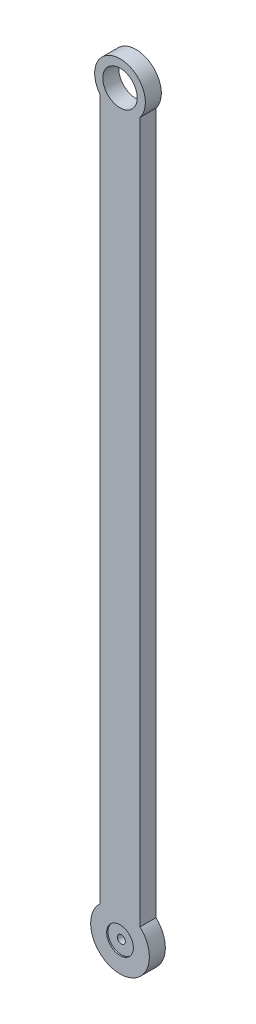
ISO-10303-21;
HEADER;
FILE_DESCRIPTION(('STEP AP214'),'2;1');
FILE_NAME('part.step','',(''),(''),'','','');
FILE_SCHEMA(('AUTOMOTIVE_DESIGN { 1 0 10303 214 1 1 1 1 }'));
ENDSEC;
DATA;
#1=APPLICATION_CONTEXT('core data for automotive mechanical design processes');
#2=APPLICATION_PROTOCOL_DEFINITION('international standard','automotive_design',2000,#1);
#3=PRODUCT_CONTEXT('',#1,'mechanical');
#4=PRODUCT('Part','Part','',(#3));
#5=PRODUCT_RELATED_PRODUCT_CATEGORY('part','',(#4));
#6=PRODUCT_DEFINITION_FORMATION('','',#4);
#7=PRODUCT_DEFINITION_CONTEXT('part definition',#1,'design');
#8=PRODUCT_DEFINITION('design','',#6,#7);
#9=PRODUCT_DEFINITION_SHAPE('','',#8);
#10=(LENGTH_UNIT() NAMED_UNIT(*) SI_UNIT(.MILLI.,.METRE.));
#11=(NAMED_UNIT(*) PLANE_ANGLE_UNIT() SI_UNIT($,.RADIAN.));
#12=(NAMED_UNIT(*) SI_UNIT($,.STERADIAN.) SOLID_ANGLE_UNIT());
#13=UNCERTAINTY_MEASURE_WITH_UNIT(LENGTH_MEASURE(1.E-05),#10,'distance_accuracy_value','');
#14=(GEOMETRIC_REPRESENTATION_CONTEXT(3) GLOBAL_UNCERTAINTY_ASSIGNED_CONTEXT((#13)) GLOBAL_UNIT_ASSIGNED_CONTEXT((#10,
#11,#12)) REPRESENTATION_CONTEXT('',''));
#15=CARTESIAN_POINT('',(0.,0.,0.));
#16=DIRECTION('',(0.,0.,1.));
#17=DIRECTION('',(1.,0.,0.));
#18=AXIS2_PLACEMENT_3D('',#15,#16,#17);
#19=CARTESIAN_POINT('',(7.5,7.5,10.));
#20=DIRECTION('',(0.,0.,-1.));
#21=DIRECTION('',(-1.,0.,0.));
#22=AXIS2_PLACEMENT_3D('',#19,#20,#21);
#23=CYLINDRICAL_SURFACE('',#22,1.5);
#24=CARTESIAN_POINT('',(7.5,7.5,0.));
#25=DIRECTION('',(0.,0.,-1.));
#26=DIRECTION('',(-1.,0.,0.));
#27=AXIS2_PLACEMENT_3D('',#24,#25,#26);
#28=CIRCLE('',#27,1.5);
#29=CARTESIAN_POINT('',(6.,7.5,0.));
#30=VERTEX_POINT('',#29);
#31=EDGE_CURVE('E105',#30,#30,#28,.T.);
#32=ORIENTED_EDGE('',*,*,#31,.T.);
#33=EDGE_LOOP('',(#32));
#34=FACE_BOUND('',#33,.T.);
#35=CARTESIAN_POINT('',(7.5,7.5,5.5));
#36=DIRECTION('',(0.,0.,1.));
#37=DIRECTION('',(1.,0.,0.));
#38=AXIS2_PLACEMENT_3D('',#35,#36,#37);
#39=CIRCLE('',#38,1.5);
#40=CARTESIAN_POINT('',(9.,7.5,5.5));
#41=VERTEX_POINT('',#40);
#42=EDGE_CURVE('E37',#41,#41,#39,.F.);
#43=ORIENTED_EDGE('',*,*,#42,.F.);
#44=EDGE_LOOP('',(#43));
#45=FACE_BOUND('',#44,.T.);
#46=ADVANCED_FACE('F33',(#34,#45),#23,.F.);
#47=CARTESIAN_POINT('',(0.,0.,6.));
#48=DIRECTION('',(1.,0.,0.));
#49=DIRECTION('',(0.,0.,-1.));
#50=AXIS2_PLACEMENT_3D('',#47,#48,#49);
#51=PLANE('',#50);
#52=DIRECTION('',(0.,-1.,0.));
#53=VECTOR('',#52,1.);
#54=CARTESIAN_POINT('',(0.,0.,6.));
#55=LINE('',#54,#53);
#56=CARTESIAN_POINT('',(0.,278.419048105155,6.));
#57=VERTEX_POINT('',#56);
#58=CARTESIAN_POINT('',(0.,15.5467384697156,6.));
#59=VERTEX_POINT('',#58);
#60=EDGE_CURVE('E42',#57,#59,#55,.T.);
#61=ORIENTED_EDGE('',*,*,#60,.F.);
#62=DIRECTION('',(0.,0.,1.));
#63=VECTOR('',#62,1.);
#64=CARTESIAN_POINT('',(0.,278.419048105155,0.));
#65=LINE('',#64,#63);
#66=CARTESIAN_POINT('',(0.,278.419048105155,0.));
#67=VERTEX_POINT('',#66);
#68=EDGE_CURVE('E76',#57,#67,#65,.F.);
#69=ORIENTED_EDGE('',*,*,#68,.T.);
#70=DIRECTION('',(0.,-1.,0.));
#71=VECTOR('',#70,1.);
#72=CARTESIAN_POINT('',(0.,0.,0.));
#73=LINE('',#72,#71);
#74=CARTESIAN_POINT('',(0.,15.5467384697156,0.));
#75=VERTEX_POINT('',#74);
#76=EDGE_CURVE('E87',#67,#75,#73,.T.);
#77=ORIENTED_EDGE('',*,*,#76,.T.);
#78=DIRECTION('',(0.,0.,1.));
#79=VECTOR('',#78,1.);
#80=CARTESIAN_POINT('',(0.,15.5467384697156,0.));
#81=LINE('',#80,#79);
#82=EDGE_CURVE('E94',#75,#59,#81,.T.);
#83=ORIENTED_EDGE('',*,*,#82,.T.);
#84=EDGE_LOOP('',(#61,#69,#77,#83));
#85=FACE_BOUND('',#84,.T.);
#86=ADVANCED_FACE('F35',(#85),#51,.F.);
#87=CARTESIAN_POINT('',(15.,0.,6.));
#88=DIRECTION('',(-1.,0.,0.));
#89=DIRECTION('',(0.,0.,1.));
#90=AXIS2_PLACEMENT_3D('',#87,#88,#89);
#91=PLANE('',#90);
#92=DIRECTION('',(0.,1.,0.));
#93=VECTOR('',#92,1.);
#94=CARTESIAN_POINT('',(15.,0.,0.));
#95=LINE('',#94,#93);
#96=CARTESIAN_POINT('',(15.,15.5467384697156,0.));
#97=VERTEX_POINT('',#96);
#98=CARTESIAN_POINT('',(15.,278.419048105155,0.));
#99=VERTEX_POINT('',#98);
#100=EDGE_CURVE('E93',#97,#99,#95,.T.);
#101=ORIENTED_EDGE('',*,*,#100,.T.);
#102=DIRECTION('',(0.,0.,1.));
#103=VECTOR('',#102,1.);
#104=CARTESIAN_POINT('',(15.,278.419048105155,0.));
#105=LINE('',#104,#103);
#106=CARTESIAN_POINT('',(15.,278.419048105155,6.));
#107=VERTEX_POINT('',#106);
#108=EDGE_CURVE('E78',#99,#107,#105,.T.);
#109=ORIENTED_EDGE('',*,*,#108,.T.);
#110=DIRECTION('',(0.,1.,0.));
#111=VECTOR('',#110,1.);
#112=CARTESIAN_POINT('',(15.,0.,6.));
#113=LINE('',#112,#111);
#114=CARTESIAN_POINT('',(15.,15.5467384697156,6.));
#115=VERTEX_POINT('',#114);
#116=EDGE_CURVE('E11',#115,#107,#113,.T.);
#117=ORIENTED_EDGE('',*,*,#116,.F.);
#118=DIRECTION('',(0.,0.,1.));
#119=VECTOR('',#118,1.);
#120=CARTESIAN_POINT('',(15.,15.5467384697156,0.));
#121=LINE('',#120,#119);
#122=EDGE_CURVE('E96',#115,#97,#121,.F.);
#123=ORIENTED_EDGE('',*,*,#122,.T.);
#124=EDGE_LOOP('',(#101,#109,#117,#123));
#125=FACE_BOUND('',#124,.T.);
#126=ADVANCED_FACE('F133',(#125),#91,.F.);
#127=CARTESIAN_POINT('',(0.,0.,6.));
#128=DIRECTION('',(0.,0.,-1.));
#129=DIRECTION('',(-1.,0.,0.));
#130=AXIS2_PLACEMENT_3D('',#127,#128,#129);
#131=PLANE('',#130);
#132=CARTESIAN_POINT('',(7.5,7.5,6.));
#133=DIRECTION('',(0.,0.,1.));
#134=DIRECTION('',(1.,0.,0.));
#135=AXIS2_PLACEMENT_3D('',#132,#133,#134);
#136=CIRCLE('',#135,5.);
#137=CARTESIAN_POINT('',(12.5,7.5,6.));
#138=VERTEX_POINT('',#137);
#139=EDGE_CURVE('E115',#138,#138,#136,.T.);
#140=ORIENTED_EDGE('',*,*,#139,.F.);
#141=EDGE_LOOP('',(#140));
#142=FACE_BOUND('',#141,.T.);
#143=CARTESIAN_POINT('',(7.5,284.25,6.));
#144=DIRECTION('',(0.,0.,-1.));
#145=DIRECTION('',(-1.,0.,0.));
#146=AXIS2_PLACEMENT_3D('',#143,#144,#145);
#147=CIRCLE('',#146,6.45);
#148=CARTESIAN_POINT('',(1.05,284.25,6.));
#149=VERTEX_POINT('',#148);
#150=EDGE_CURVE('E109',#149,#149,#147,.T.);
#151=ORIENTED_EDGE('',*,*,#150,.T.);
#152=EDGE_LOOP('',(#151));
#153=FACE_BOUND('',#152,.T.);
#154=CARTESIAN_POINT('',(7.5,284.25,6.));
#155=DIRECTION('',(0.,0.,1.));
#156=DIRECTION('',(1.,0.,0.));
#157=AXIS2_PLACEMENT_3D('',#154,#155,#156);
#158=CIRCLE('',#157,9.50000000000001);
#159=EDGE_CURVE('E83',#107,#57,#158,.T.);
#160=ORIENTED_EDGE('',*,*,#159,.T.);
#161=ORIENTED_EDGE('',*,*,#60,.T.);
#162=CARTESIAN_POINT('',(7.5,7.5,6.));
#163=DIRECTION('',(0.,0.,1.));
#164=DIRECTION('',(1.,0.,0.));
#165=AXIS2_PLACEMENT_3D('',#162,#163,#164);
#166=CIRCLE('',#165,11.);
#167=EDGE_CURVE('E49',#59,#115,#166,.T.);
#168=ORIENTED_EDGE('',*,*,#167,.T.);
#169=ORIENTED_EDGE('',*,*,#116,.T.);
#170=EDGE_LOOP('',(#160,#161,#168,#169));
#171=FACE_BOUND('',#170,.T.);
#172=ADVANCED_FACE('F144',(#142,#153,#171),#131,.F.);
#173=CARTESIAN_POINT('',(0.,0.,0.));
#174=DIRECTION('',(0.,0.,-1.));
#175=DIRECTION('',(-1.,0.,0.));
#176=AXIS2_PLACEMENT_3D('',#173,#174,#175);
#177=PLANE('',#176);
#178=CARTESIAN_POINT('',(7.5,284.25,0.));
#179=DIRECTION('',(0.,0.,-1.));
#180=DIRECTION('',(-1.,0.,0.));
#181=AXIS2_PLACEMENT_3D('',#178,#179,#180);
#182=CIRCLE('',#181,6.45);
#183=CARTESIAN_POINT('',(1.05,284.25,0.));
#184=VERTEX_POINT('',#183);
#185=EDGE_CURVE('E112',#184,#184,#182,.T.);
#186=ORIENTED_EDGE('',*,*,#185,.F.);
#187=EDGE_LOOP('',(#186));
#188=FACE_BOUND('',#187,.T.);
#189=ORIENTED_EDGE('',*,*,#31,.F.);
#190=EDGE_LOOP('',(#189));
#191=FACE_BOUND('',#190,.T.);
#192=ORIENTED_EDGE('',*,*,#76,.F.);
#193=CARTESIAN_POINT('',(7.5,284.25,0.));
#194=DIRECTION('',(0.,0.,1.));
#195=DIRECTION('',(1.,0.,0.));
#196=AXIS2_PLACEMENT_3D('',#193,#194,#195);
#197=CIRCLE('',#196,9.50000000000001);
#198=EDGE_CURVE('E73',#99,#67,#197,.T.);
#199=ORIENTED_EDGE('',*,*,#198,.F.);
#200=ORIENTED_EDGE('',*,*,#100,.F.);
#201=CARTESIAN_POINT('',(7.5,7.5,0.));
#202=DIRECTION('',(0.,0.,1.));
#203=DIRECTION('',(1.,0.,0.));
#204=AXIS2_PLACEMENT_3D('',#201,#202,#203);
#205=CIRCLE('',#204,11.);
#206=EDGE_CURVE('E92',#75,#97,#205,.T.);
#207=ORIENTED_EDGE('',*,*,#206,.F.);
#208=EDGE_LOOP('',(#192,#199,#200,#207));
#209=FACE_BOUND('',#208,.T.);
#210=ADVANCED_FACE('F91',(#188,#191,#209),#177,.T.);
#211=CARTESIAN_POINT('',(7.5,7.5,0.));
#212=DIRECTION('',(0.,0.,1.));
#213=DIRECTION('',(1.,0.,0.));
#214=AXIS2_PLACEMENT_3D('',#211,#212,#213);
#215=CYLINDRICAL_SURFACE('',#214,11.);
#216=ORIENTED_EDGE('',*,*,#82,.F.);
#217=ORIENTED_EDGE('',*,*,#206,.T.);
#218=ORIENTED_EDGE('',*,*,#122,.F.);
#219=ORIENTED_EDGE('',*,*,#167,.F.);
#220=EDGE_LOOP('',(#216,#217,#218,#219));
#221=FACE_BOUND('',#220,.T.);
#222=ADVANCED_FACE('F140',(#221),#215,.T.);
#223=CARTESIAN_POINT('',(7.5,284.25,0.));
#224=DIRECTION('',(0.,0.,1.));
#225=DIRECTION('',(1.,0.,0.));
#226=AXIS2_PLACEMENT_3D('',#223,#224,#225);
#227=CYLINDRICAL_SURFACE('',#226,9.50000000000001);
#228=ORIENTED_EDGE('',*,*,#68,.F.);
#229=ORIENTED_EDGE('',*,*,#159,.F.);
#230=ORIENTED_EDGE('',*,*,#108,.F.);
#231=ORIENTED_EDGE('',*,*,#198,.T.);
#232=EDGE_LOOP('',(#228,#229,#230,#231));
#233=FACE_BOUND('',#232,.T.);
#234=ADVANCED_FACE('F75',(#233),#227,.T.);
#235=CARTESIAN_POINT('',(7.5,284.25,10.));
#236=DIRECTION('',(0.,0.,-1.));
#237=DIRECTION('',(-1.,0.,0.));
#238=AXIS2_PLACEMENT_3D('',#235,#236,#237);
#239=CYLINDRICAL_SURFACE('',#238,6.45);
#240=ORIENTED_EDGE('',*,*,#185,.T.);
#241=EDGE_LOOP('',(#240));
#242=FACE_BOUND('',#241,.T.);
#243=ORIENTED_EDGE('',*,*,#150,.F.);
#244=EDGE_LOOP('',(#243));
#245=FACE_BOUND('',#244,.T.);
#246=ADVANCED_FACE('F136',(#242,#245),#239,.F.);
#247=CARTESIAN_POINT('',(7.5,7.5,5.5));
#248=DIRECTION('',(0.,0.,1.));
#249=DIRECTION('',(1.,0.,0.));
#250=AXIS2_PLACEMENT_3D('',#247,#248,#249);
#251=PLANE('',#250);
#252=CARTESIAN_POINT('',(7.5,7.5,5.5));
#253=DIRECTION('',(0.,0.,1.));
#254=DIRECTION('',(1.,0.,0.));
#255=AXIS2_PLACEMENT_3D('',#252,#253,#254);
#256=CIRCLE('',#255,5.);
#257=CARTESIAN_POINT('',(12.5,7.5,5.5));
#258=VERTEX_POINT('',#257);
#259=EDGE_CURVE('E118',#258,#258,#256,.T.);
#260=ORIENTED_EDGE('',*,*,#259,.T.);
#261=EDGE_LOOP('',(#260));
#262=FACE_BOUND('',#261,.T.);
#263=ORIENTED_EDGE('',*,*,#42,.T.);
#264=EDGE_LOOP('',(#263));
#265=FACE_BOUND('',#264,.T.);
#266=ADVANCED_FACE('F125',(#262,#265),#251,.T.);
#267=CARTESIAN_POINT('',(7.5,7.5,5.5));
#268=DIRECTION('',(0.,0.,1.));
#269=DIRECTION('',(1.,0.,0.));
#270=AXIS2_PLACEMENT_3D('',#267,#268,#269);
#271=CYLINDRICAL_SURFACE('',#270,5.);
#272=ORIENTED_EDGE('',*,*,#259,.F.);
#273=EDGE_LOOP('',(#272));
#274=FACE_BOUND('',#273,.T.);
#275=ORIENTED_EDGE('',*,*,#139,.T.);
#276=EDGE_LOOP('',(#275));
#277=FACE_BOUND('',#276,.T.);
#278=ADVANCED_FACE('F185',(#274,#277),#271,.F.);
#279=CLOSED_SHELL('',(#46,#86,#126,#172,#210,#222,#234,#246,#266,#278));
#280=MANIFOLD_SOLID_BREP('B2',#279);
#281=ADVANCED_BREP_SHAPE_REPRESENTATION('',(#18,#280),#14);
#282=SHAPE_DEFINITION_REPRESENTATION(#9,#281);
ENDSEC;
END-ISO-10303-21;
